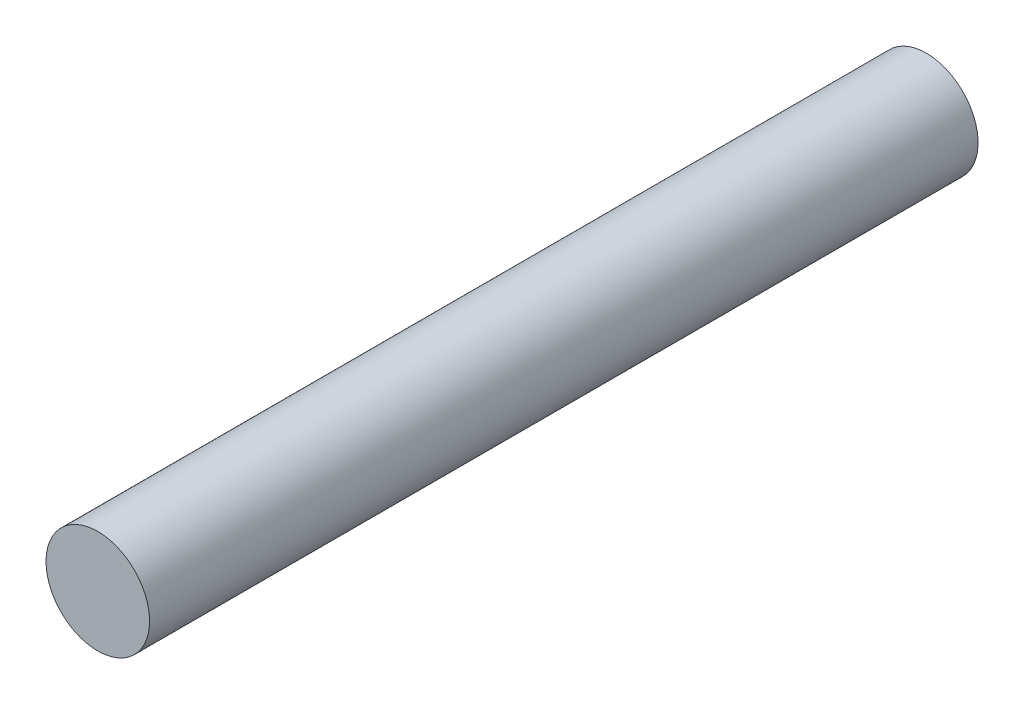
ISO-10303-21;
HEADER;
FILE_DESCRIPTION(('STEP AP214'),'2;1');
FILE_NAME('part.step','',(''),(''),'','','');
FILE_SCHEMA(('AUTOMOTIVE_DESIGN { 1 0 10303 214 1 1 1 1 }'));
ENDSEC;
DATA;
#1=APPLICATION_CONTEXT('core data for automotive mechanical design processes');
#2=APPLICATION_PROTOCOL_DEFINITION('international standard','automotive_design',2000,#1);
#3=PRODUCT_CONTEXT('',#1,'mechanical');
#4=PRODUCT('Part','Part','',(#3));
#5=PRODUCT_RELATED_PRODUCT_CATEGORY('part','',(#4));
#6=PRODUCT_DEFINITION_FORMATION('','',#4);
#7=PRODUCT_DEFINITION_CONTEXT('part definition',#1,'design');
#8=PRODUCT_DEFINITION('design','',#6,#7);
#9=PRODUCT_DEFINITION_SHAPE('','',#8);
#10=(LENGTH_UNIT() NAMED_UNIT(*) SI_UNIT(.MILLI.,.METRE.));
#11=(NAMED_UNIT(*) PLANE_ANGLE_UNIT() SI_UNIT($,.RADIAN.));
#12=(NAMED_UNIT(*) SI_UNIT($,.STERADIAN.) SOLID_ANGLE_UNIT());
#13=UNCERTAINTY_MEASURE_WITH_UNIT(LENGTH_MEASURE(1.E-05),#10,'distance_accuracy_value','');
#14=(GEOMETRIC_REPRESENTATION_CONTEXT(3) GLOBAL_UNCERTAINTY_ASSIGNED_CONTEXT((#13)) GLOBAL_UNIT_ASSIGNED_CONTEXT((#10,
#11,#12)) REPRESENTATION_CONTEXT('',''));
#15=CARTESIAN_POINT('',(0.,0.,0.));
#16=DIRECTION('',(0.,0.,1.));
#17=DIRECTION('',(1.,0.,0.));
#18=AXIS2_PLACEMENT_3D('',#15,#16,#17);
#19=CARTESIAN_POINT('',(0.,0.,100.));
#20=DIRECTION('',(0.,0.,-1.));
#21=DIRECTION('',(-1.,0.,0.));
#22=AXIS2_PLACEMENT_3D('',#19,#20,#21);
#23=CYLINDRICAL_SURFACE('',#22,6.25);
#24=CARTESIAN_POINT('',(0.,0.,100.));
#25=DIRECTION('',(0.,0.,1.));
#26=DIRECTION('',(1.,0.,0.));
#27=AXIS2_PLACEMENT_3D('',#24,#25,#26);
#28=CIRCLE('',#27,6.25);
#29=CARTESIAN_POINT('',(-6.25,0.,100.));
#30=VERTEX_POINT('',#29);
#31=EDGE_CURVE('E10',#30,#30,#28,.T.);
#32=CARTESIAN_POINT('',(0.,0.,0.));
#33=DIRECTION('',(0.,0.,1.));
#34=DIRECTION('',(1.,0.,0.));
#35=AXIS2_PLACEMENT_3D('',#32,#33,#34);
#36=CIRCLE('',#35,6.25);
#37=CARTESIAN_POINT('',(-6.25,0.,0.));
#38=VERTEX_POINT('',#37);
#39=EDGE_CURVE('E34',#38,#38,#36,.T.);
#40=CARTESIAN_POINT('',(-6.25,0.,100.));
#41=CARTESIAN_POINT('',(-6.25,0.,98.9583333333333));
#42=CARTESIAN_POINT('',(-6.25,0.,97.9166666666667));
#43=CARTESIAN_POINT('',(-6.25,0.,95.8333333333333));
#44=CARTESIAN_POINT('',(-6.25,0.,94.7916666666666));
#45=CARTESIAN_POINT('',(-6.25,0.,92.7083333333333));
#46=CARTESIAN_POINT('',(-6.25,0.,91.6666666666666));
#47=CARTESIAN_POINT('',(-6.25,0.,89.5833333333333));
#48=CARTESIAN_POINT('',(-6.25,0.,88.5416666666667));
#49=CARTESIAN_POINT('',(-6.25,0.,86.4583333333333));
#50=CARTESIAN_POINT('',(-6.25,0.,85.4166666666667));
#51=CARTESIAN_POINT('',(-6.25,0.,83.3333333333333));
#52=CARTESIAN_POINT('',(-6.25,0.,82.2916666666667));
#53=CARTESIAN_POINT('',(-6.25,0.,80.2083333333333));
#54=CARTESIAN_POINT('',(-6.25,0.,79.1666666666666));
#55=CARTESIAN_POINT('',(-6.25,0.,77.0833333333333));
#56=CARTESIAN_POINT('',(-6.25,0.,76.0416666666666));
#57=CARTESIAN_POINT('',(-6.25,0.,73.9583333333333));
#58=CARTESIAN_POINT('',(-6.25,0.,72.9166666666667));
#59=CARTESIAN_POINT('',(-6.25,0.,70.8333333333333));
#60=CARTESIAN_POINT('',(-6.25,0.,69.7916666666667));
#61=CARTESIAN_POINT('',(-6.25,0.,67.7083333333333));
#62=CARTESIAN_POINT('',(-6.25,0.,66.6666666666667));
#63=CARTESIAN_POINT('',(-6.25,0.,64.5833333333333));
#64=CARTESIAN_POINT('',(-6.25,0.,63.5416666666667));
#65=CARTESIAN_POINT('',(-6.25,0.,61.4583333333333));
#66=CARTESIAN_POINT('',(-6.25,0.,60.4166666666667));
#67=CARTESIAN_POINT('',(-6.25,0.,58.3333333333333));
#68=CARTESIAN_POINT('',(-6.25,0.,57.2916666666667));
#69=CARTESIAN_POINT('',(-6.25,0.,55.2083333333333));
#70=CARTESIAN_POINT('',(-6.25,0.,54.1666666666667));
#71=CARTESIAN_POINT('',(-6.25,0.,52.0833333333333));
#72=CARTESIAN_POINT('',(-6.25,0.,51.0416666666667));
#73=CARTESIAN_POINT('',(-6.25,0.,48.9583333333333));
#74=CARTESIAN_POINT('',(-6.25,0.,47.9166666666667));
#75=CARTESIAN_POINT('',(-6.25,0.,45.8333333333333));
#76=CARTESIAN_POINT('',(-6.25,0.,44.7916666666667));
#77=CARTESIAN_POINT('',(-6.25,0.,42.7083333333333));
#78=CARTESIAN_POINT('',(-6.25,0.,41.6666666666667));
#79=CARTESIAN_POINT('',(-6.25,0.,39.5833333333333));
#80=CARTESIAN_POINT('',(-6.25,0.,38.5416666666667));
#81=CARTESIAN_POINT('',(-6.25,0.,36.4583333333333));
#82=CARTESIAN_POINT('',(-6.25,0.,35.4166666666667));
#83=CARTESIAN_POINT('',(-6.25,0.,33.3333333333333));
#84=CARTESIAN_POINT('',(-6.25,0.,32.2916666666667));
#85=CARTESIAN_POINT('',(-6.25,0.,30.2083333333333));
#86=CARTESIAN_POINT('',(-6.25,0.,29.1666666666667));
#87=CARTESIAN_POINT('',(-6.25,0.,27.0833333333333));
#88=CARTESIAN_POINT('',(-6.25,0.,26.0416666666667));
#89=CARTESIAN_POINT('',(-6.25,0.,23.9583333333333));
#90=CARTESIAN_POINT('',(-6.25,0.,22.9166666666667));
#91=CARTESIAN_POINT('',(-6.25,0.,20.8333333333333));
#92=CARTESIAN_POINT('',(-6.25,0.,19.7916666666667));
#93=CARTESIAN_POINT('',(-6.25,0.,17.7083333333333));
#94=CARTESIAN_POINT('',(-6.25,0.,16.6666666666667));
#95=CARTESIAN_POINT('',(-6.25,0.,14.5833333333333));
#96=CARTESIAN_POINT('',(-6.25,0.,13.5416666666667));
#97=CARTESIAN_POINT('',(-6.25,0.,11.4583333333333));
#98=CARTESIAN_POINT('',(-6.25,0.,10.4166666666667));
#99=CARTESIAN_POINT('',(-6.25,0.,8.33333333333333));
#100=CARTESIAN_POINT('',(-6.25,0.,7.29166666666667));
#101=CARTESIAN_POINT('',(-6.25,0.,5.20833333333334));
#102=CARTESIAN_POINT('',(-6.25,0.,4.16666666666667));
#103=CARTESIAN_POINT('',(-6.25,0.,2.08333333333334));
#104=CARTESIAN_POINT('',(-6.25,0.,1.04166666666667));
#105=CARTESIAN_POINT('',(-6.25,0.,0.));
#106=B_SPLINE_CURVE_WITH_KNOTS('',3,(#40,#41,#42,#43,#44,#45,#46,#47,#48,#49,#50,#51,#52,#53,
#54,#55,#56,#57,#58,#59,#60,#61,#62,#63,#64,#65,#66,#67,#68,#69,#70,#71,#72,#73,#74,#75,#76,#77,
#78,#79,#80,#81,#82,#83,#84,#85,#86,#87,#88,#89,#90,#91,#92,#93,#94,#95,#96,#97,#98,#99,#100,
#101,#102,#103,#104,#105),.UNSPECIFIED.,.F.,.F.,(4,2,2,2,2,2,2,2,2,2,2,2,2,2,2,2,2,2,2,2,2,2,2,
2,2,2,2,2,2,2,2,2,4),(0.,3.12499999999999,6.24999999999999,9.37499999999999,12.5,15.625,18.75,
21.875,25.,28.125,31.25,34.375,37.5,40.625,43.75,46.875,50.,53.125,56.25,59.375,62.5,65.625,
68.75,71.875,75.,78.125,81.25,84.375,87.5,90.625,93.75,96.875,100.),.UNSPECIFIED.);
#107=EDGE_CURVE('BSEAM31',#30,#38,#106,.T.);
#108=ORIENTED_EDGE('',*,*,#31,.F.);
#109=ORIENTED_EDGE('',*,*,#39,.T.);
#110=ORIENTED_EDGE('',*,*,#107,.T.);
#111=ORIENTED_EDGE('',*,*,#107,.F.);
#112=EDGE_LOOP('',(#108,#110,#109,#111));
#113=FACE_BOUND('',#112,.T.);
#114=ADVANCED_FACE('F31',(#113),#23,.T.);
#115=CARTESIAN_POINT('',(0.,0.,100.));
#116=DIRECTION('',(0.,0.,1.));
#117=DIRECTION('',(1.,0.,0.));
#118=AXIS2_PLACEMENT_3D('',#115,#116,#117);
#119=PLANE('',#118);
#120=ORIENTED_EDGE('',*,*,#31,.T.);
#121=EDGE_LOOP('',(#120));
#122=FACE_BOUND('',#121,.T.);
#123=ADVANCED_FACE('F46',(#122),#119,.T.);
#124=CARTESIAN_POINT('',(0.,0.,0.));
#125=DIRECTION('',(0.,0.,1.));
#126=DIRECTION('',(1.,0.,0.));
#127=AXIS2_PLACEMENT_3D('',#124,#125,#126);
#128=PLANE('',#127);
#129=ORIENTED_EDGE('',*,*,#39,.F.);
#130=EDGE_LOOP('',(#129));
#131=FACE_BOUND('',#130,.T.);
#132=ADVANCED_FACE('F44',(#131),#128,.F.);
#133=CLOSED_SHELL('',(#114,#123,#132));
#134=MANIFOLD_SOLID_BREP('B2',#133);
#135=ADVANCED_BREP_SHAPE_REPRESENTATION('',(#18,#134),#14);
#136=SHAPE_DEFINITION_REPRESENTATION(#9,#135);
ENDSEC;
END-ISO-10303-21;
